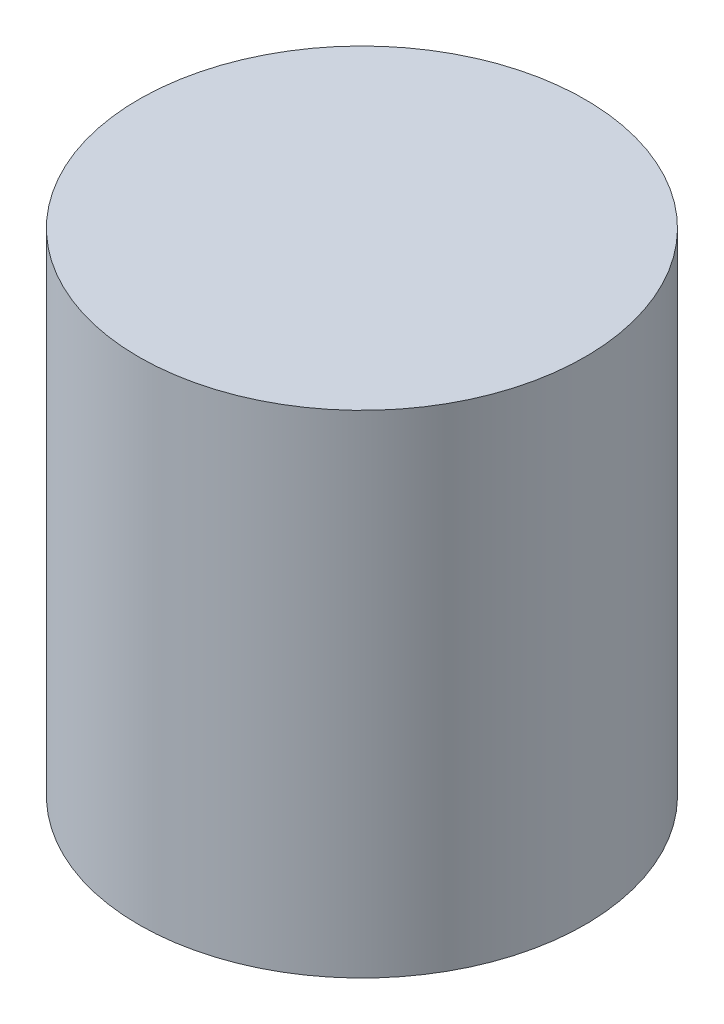
ISO-10303-21;
HEADER;
FILE_DESCRIPTION(('STEP AP214'),'2;1');
FILE_NAME('part.step','',(''),(''),'','','');
FILE_SCHEMA(('AUTOMOTIVE_DESIGN { 1 0 10303 214 1 1 1 1 }'));
ENDSEC;
DATA;
#1=APPLICATION_CONTEXT('core data for automotive mechanical design processes');
#2=APPLICATION_PROTOCOL_DEFINITION('international standard','automotive_design',2000,#1);
#3=PRODUCT_CONTEXT('',#1,'mechanical');
#4=PRODUCT('Part','Part','',(#3));
#5=PRODUCT_RELATED_PRODUCT_CATEGORY('part','',(#4));
#6=PRODUCT_DEFINITION_FORMATION('','',#4);
#7=PRODUCT_DEFINITION_CONTEXT('part definition',#1,'design');
#8=PRODUCT_DEFINITION('design','',#6,#7);
#9=PRODUCT_DEFINITION_SHAPE('','',#8);
#10=(LENGTH_UNIT() NAMED_UNIT(*) SI_UNIT(.MILLI.,.METRE.));
#11=(NAMED_UNIT(*) PLANE_ANGLE_UNIT() SI_UNIT($,.RADIAN.));
#12=(NAMED_UNIT(*) SI_UNIT($,.STERADIAN.) SOLID_ANGLE_UNIT());
#13=UNCERTAINTY_MEASURE_WITH_UNIT(LENGTH_MEASURE(1.E-05),#10,'distance_accuracy_value','');
#14=(GEOMETRIC_REPRESENTATION_CONTEXT(3) GLOBAL_UNCERTAINTY_ASSIGNED_CONTEXT((#13)) GLOBAL_UNIT_ASSIGNED_CONTEXT((#10,
#11,#12)) REPRESENTATION_CONTEXT('',''));
#15=CARTESIAN_POINT('',(0.,0.,0.));
#16=DIRECTION('',(0.,0.,1.));
#17=DIRECTION('',(1.,0.,0.));
#18=AXIS2_PLACEMENT_3D('',#15,#16,#17);
#19=CARTESIAN_POINT('',(0.,65.,0.));
#20=DIRECTION('',(0.,-1.,0.));
#21=DIRECTION('',(0.,0.,-1.));
#22=AXIS2_PLACEMENT_3D('',#19,#20,#21);
#23=CYLINDRICAL_SURFACE('',#22,29.5);
#24=CARTESIAN_POINT('',(0.,65.,0.));
#25=DIRECTION('',(0.,1.,0.));
#26=DIRECTION('',(0.,0.,1.));
#27=AXIS2_PLACEMENT_3D('',#24,#25,#26);
#28=CIRCLE('',#27,29.5);
#29=CARTESIAN_POINT('',(0.,65.,29.5));
#30=VERTEX_POINT('',#29);
#31=EDGE_CURVE('E10',#30,#30,#28,.T.);
#32=ORIENTED_EDGE('',*,*,#31,.F.);
#33=EDGE_LOOP('',(#32));
#34=FACE_BOUND('',#33,.T.);
#35=CARTESIAN_POINT('',(0.,0.,0.));
#36=DIRECTION('',(0.,1.,0.));
#37=DIRECTION('',(0.,0.,1.));
#38=AXIS2_PLACEMENT_3D('',#35,#36,#37);
#39=CIRCLE('',#38,29.5);
#40=CARTESIAN_POINT('',(0.,0.,29.5));
#41=VERTEX_POINT('',#40);
#42=EDGE_CURVE('E33',#41,#41,#39,.T.);
#43=ORIENTED_EDGE('',*,*,#42,.T.);
#44=EDGE_LOOP('',(#43));
#45=FACE_BOUND('',#44,.T.);
#46=ADVANCED_FACE('F30',(#34,#45),#23,.T.);
#47=CARTESIAN_POINT('',(0.,65.,0.));
#48=DIRECTION('',(0.,1.,0.));
#49=DIRECTION('',(0.,0.,1.));
#50=AXIS2_PLACEMENT_3D('',#47,#48,#49);
#51=PLANE('',#50);
#52=ORIENTED_EDGE('',*,*,#31,.T.);
#53=EDGE_LOOP('',(#52));
#54=FACE_BOUND('',#53,.T.);
#55=ADVANCED_FACE('F59',(#54),#51,.T.);
#56=CARTESIAN_POINT('',(0.,0.,0.));
#57=DIRECTION('',(0.,1.,0.));
#58=DIRECTION('',(0.,0.,1.));
#59=AXIS2_PLACEMENT_3D('',#56,#57,#58);
#60=PLANE('',#59);
#61=CARTESIAN_POINT('',(0.,0.,0.));
#62=DIRECTION('',(0.,-1.,0.));
#63=DIRECTION('',(0.,0.,-1.));
#64=AXIS2_PLACEMENT_3D('',#61,#62,#63);
#65=CIRCLE('',#64,26.);
#66=CARTESIAN_POINT('',(0.,0.,-26.));
#67=VERTEX_POINT('',#66);
#68=EDGE_CURVE('E42',#67,#67,#65,.T.);
#69=ORIENTED_EDGE('',*,*,#68,.F.);
#70=EDGE_LOOP('',(#69));
#71=FACE_BOUND('',#70,.T.);
#72=ORIENTED_EDGE('',*,*,#42,.F.);
#73=EDGE_LOOP('',(#72));
#74=FACE_BOUND('',#73,.T.);
#75=ADVANCED_FACE('F53',(#71,#74),#60,.F.);
#76=CARTESIAN_POINT('',(0.,58.65,0.));
#77=DIRECTION('',(0.,-1.,0.));
#78=DIRECTION('',(0.,0.,-1.));
#79=AXIS2_PLACEMENT_3D('',#76,#77,#78);
#80=CYLINDRICAL_SURFACE('',#79,26.);
#81=CARTESIAN_POINT('',(0.,58.65,0.));
#82=DIRECTION('',(0.,-1.,0.));
#83=DIRECTION('',(0.,0.,-1.));
#84=AXIS2_PLACEMENT_3D('',#81,#82,#83);
#85=CIRCLE('',#84,26.);
#86=CARTESIAN_POINT('',(0.,58.65,-26.));
#87=VERTEX_POINT('',#86);
#88=EDGE_CURVE('E40',#87,#87,#85,.T.);
#89=ORIENTED_EDGE('',*,*,#88,.F.);
#90=EDGE_LOOP('',(#89));
#91=FACE_BOUND('',#90,.T.);
#92=ORIENTED_EDGE('',*,*,#68,.T.);
#93=EDGE_LOOP('',(#92));
#94=FACE_BOUND('',#93,.T.);
#95=ADVANCED_FACE('F50',(#91,#94),#80,.F.);
#96=CARTESIAN_POINT('',(0.,58.65,0.));
#97=DIRECTION('',(0.,-1.,0.));
#98=DIRECTION('',(0.,0.,-1.));
#99=AXIS2_PLACEMENT_3D('',#96,#97,#98);
#100=PLANE('',#99);
#101=ORIENTED_EDGE('',*,*,#88,.T.);
#102=EDGE_LOOP('',(#101));
#103=FACE_BOUND('',#102,.T.);
#104=ADVANCED_FACE('F48',(#103),#100,.T.);
#105=CLOSED_SHELL('',(#46,#55,#75,#95,#104));
#106=MANIFOLD_SOLID_BREP('B2',#105);
#107=ADVANCED_BREP_SHAPE_REPRESENTATION('',(#18,#106),#14);
#108=SHAPE_DEFINITION_REPRESENTATION(#9,#107);
ENDSEC;
END-ISO-10303-21;
